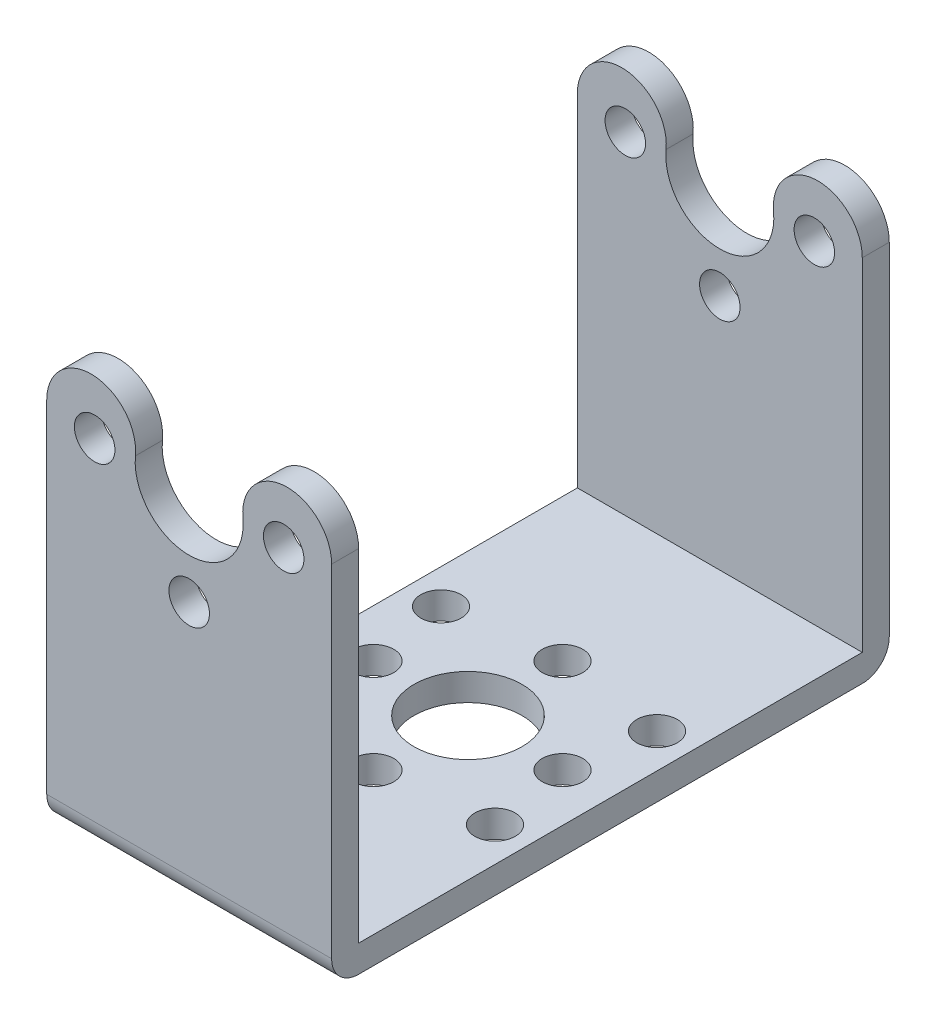
ISO-10303-21;
HEADER;
FILE_DESCRIPTION(('STEP AP214'),'2;1');
FILE_NAME('part.step','',(''),(''),'','','');
FILE_SCHEMA(('AUTOMOTIVE_DESIGN { 1 0 10303 214 1 1 1 1 }'));
ENDSEC;
DATA;
#1=APPLICATION_CONTEXT('core data for automotive mechanical design processes');
#2=APPLICATION_PROTOCOL_DEFINITION('international standard','automotive_design',2000,#1);
#3=PRODUCT_CONTEXT('',#1,'mechanical');
#4=PRODUCT('Part','Part','',(#3));
#5=PRODUCT_RELATED_PRODUCT_CATEGORY('part','',(#4));
#6=PRODUCT_DEFINITION_FORMATION('','',#4);
#7=PRODUCT_DEFINITION_CONTEXT('part definition',#1,'design');
#8=PRODUCT_DEFINITION('design','',#6,#7);
#9=PRODUCT_DEFINITION_SHAPE('','',#8);
#10=(LENGTH_UNIT() NAMED_UNIT(*) SI_UNIT(.MILLI.,.METRE.));
#11=(NAMED_UNIT(*) PLANE_ANGLE_UNIT() SI_UNIT($,.RADIAN.));
#12=(NAMED_UNIT(*) SI_UNIT($,.STERADIAN.) SOLID_ANGLE_UNIT());
#13=UNCERTAINTY_MEASURE_WITH_UNIT(LENGTH_MEASURE(1.E-05),#10,'distance_accuracy_value','');
#14=(GEOMETRIC_REPRESENTATION_CONTEXT(3) GLOBAL_UNCERTAINTY_ASSIGNED_CONTEXT((#13)) GLOBAL_UNIT_ASSIGNED_CONTEXT((#10,
#11,#12)) REPRESENTATION_CONTEXT('',''));
#15=CARTESIAN_POINT('',(0.,0.,0.));
#16=DIRECTION('',(0.,0.,1.));
#17=DIRECTION('',(1.,0.,0.));
#18=AXIS2_PLACEMENT_3D('',#15,#16,#17);
#19=CARTESIAN_POINT('',(-10.55,0.,-20.65));
#20=DIRECTION('',(-1.,0.,0.));
#21=DIRECTION('',(0.,1.,0.));
#22=AXIS2_PLACEMENT_3D('',#19,#20,#21);
#23=PLANE('',#22);
#24=CARTESIAN_POINT('',(-10.55,2.,-18.65));
#25=DIRECTION('',(1.,0.,0.));
#26=DIRECTION('',(0.,-0.707106781186548,-0.707106781186548));
#27=AXIS2_PLACEMENT_3D('',#24,#25,#26);
#28=CIRCLE('',#27,2.);
#29=CARTESIAN_POINT('',(-10.55,0.,-18.65));
#30=VERTEX_POINT('',#29);
#31=CARTESIAN_POINT('',(-10.55,2.,-20.65));
#32=VERTEX_POINT('',#31);
#33=EDGE_CURVE('E36',#30,#32,#28,.T.);
#34=ORIENTED_EDGE('',*,*,#33,.F.);
#35=DIRECTION('',(0.,0.,1.));
#36=VECTOR('',#35,1.);
#37=CARTESIAN_POINT('',(-10.55,0.,-20.65));
#38=LINE('',#37,#36);
#39=CARTESIAN_POINT('',(-10.55,0.,18.65));
#40=VERTEX_POINT('',#39);
#41=EDGE_CURVE('E11',#30,#40,#38,.T.);
#42=ORIENTED_EDGE('',*,*,#41,.T.);
#43=CARTESIAN_POINT('',(-10.55,2.,18.65));
#44=DIRECTION('',(1.,0.,0.));
#45=DIRECTION('',(0.,-0.707106781186548,0.707106781186548));
#46=AXIS2_PLACEMENT_3D('',#43,#44,#45);
#47=CIRCLE('',#46,2.);
#48=CARTESIAN_POINT('',(-10.55,2.,20.65));
#49=VERTEX_POINT('',#48);
#50=EDGE_CURVE('E330',#49,#40,#47,.T.);
#51=ORIENTED_EDGE('',*,*,#50,.F.);
#52=DIRECTION('',(0.,1.,0.));
#53=VECTOR('',#52,1.);
#54=CARTESIAN_POINT('',(-10.55,0.,20.65));
#55=LINE('',#54,#53);
#56=CARTESIAN_POINT('',(-10.55,27.307784898208,20.65));
#57=VERTEX_POINT('',#56);
#58=EDGE_CURVE('E201',#49,#57,#55,.T.);
#59=ORIENTED_EDGE('',*,*,#58,.T.);
#60=DIRECTION('',(0.,0.,1.));
#61=VECTOR('',#60,1.);
#62=CARTESIAN_POINT('',(-10.55,27.307784898208,20.65));
#63=LINE('',#62,#61);
#64=CARTESIAN_POINT('',(-10.55,27.307784898208,18.65));
#65=VERTEX_POINT('',#64);
#66=EDGE_CURVE('E222',#65,#57,#63,.T.);
#67=ORIENTED_EDGE('',*,*,#66,.F.);
#68=DIRECTION('',(0.,1.,0.));
#69=VECTOR('',#68,1.);
#70=CARTESIAN_POINT('',(-10.55,2.,18.65));
#71=LINE('',#70,#69);
#72=CARTESIAN_POINT('',(-10.55,2.,18.65));
#73=VERTEX_POINT('',#72);
#74=EDGE_CURVE('E211',#73,#65,#71,.T.);
#75=ORIENTED_EDGE('',*,*,#74,.F.);
#76=DIRECTION('',(0.,0.,1.));
#77=VECTOR('',#76,1.);
#78=CARTESIAN_POINT('',(-10.55,2.,-20.65));
#79=LINE('',#78,#77);
#80=CARTESIAN_POINT('',(-10.55,2.,-18.65));
#81=VERTEX_POINT('',#80);
#82=EDGE_CURVE('E97',#81,#73,#79,.T.);
#83=ORIENTED_EDGE('',*,*,#82,.F.);
#84=DIRECTION('',(0.,1.,0.));
#85=VECTOR('',#84,1.);
#86=CARTESIAN_POINT('',(-10.55,2.,-18.65));
#87=LINE('',#86,#85);
#88=CARTESIAN_POINT('',(-10.55,27.307784898208,-18.65));
#89=VERTEX_POINT('',#88);
#90=EDGE_CURVE('E289',#81,#89,#87,.T.);
#91=ORIENTED_EDGE('',*,*,#90,.T.);
#92=DIRECTION('',(0.,0.,1.));
#93=VECTOR('',#92,1.);
#94=CARTESIAN_POINT('',(-10.55,27.307784898208,-20.65));
#95=LINE('',#94,#93);
#96=CARTESIAN_POINT('',(-10.55,27.307784898208,-20.65));
#97=VERTEX_POINT('',#96);
#98=EDGE_CURVE('E295',#97,#89,#95,.T.);
#99=ORIENTED_EDGE('',*,*,#98,.F.);
#100=DIRECTION('',(0.,1.,0.));
#101=VECTOR('',#100,1.);
#102=CARTESIAN_POINT('',(-10.55,0.,-20.65));
#103=LINE('',#102,#101);
#104=EDGE_CURVE('E194',#32,#97,#103,.T.);
#105=ORIENTED_EDGE('',*,*,#104,.F.);
#106=EDGE_LOOP('',(#34,#42,#51,#59,#67,#75,#83,#91,#99,#105));
#107=FACE_BOUND('',#106,.T.);
#108=ADVANCED_FACE('F17',(#107),#23,.T.);
#109=CARTESIAN_POINT('',(0.,0.,0.));
#110=DIRECTION('',(0.,1.,0.));
#111=DIRECTION('',(1.,0.,0.));
#112=AXIS2_PLACEMENT_3D('',#109,#110,#111);
#113=PLANE('',#112);
#114=DIRECTION('',(-1.,0.,0.));
#115=VECTOR('',#114,1.);
#116=CARTESIAN_POINT('',(5.275,0.,-18.65));
#117=LINE('',#116,#115);
#118=CARTESIAN_POINT('',(10.55,0.,-18.65));
#119=VERTEX_POINT('',#118);
#120=EDGE_CURVE('E27',#119,#30,#117,.T.);
#121=ORIENTED_EDGE('',*,*,#120,.F.);
#122=DIRECTION('',(0.,0.,-1.));
#123=VECTOR('',#122,1.);
#124=CARTESIAN_POINT('',(10.55,0.,20.65));
#125=LINE('',#124,#123);
#126=CARTESIAN_POINT('',(10.55,0.,18.65));
#127=VERTEX_POINT('',#126);
#128=EDGE_CURVE('E175',#127,#119,#125,.T.);
#129=ORIENTED_EDGE('',*,*,#128,.F.);
#130=DIRECTION('',(1.,0.,0.));
#131=VECTOR('',#130,1.);
#132=CARTESIAN_POINT('',(-5.275,0.,18.65));
#133=LINE('',#132,#131);
#134=EDGE_CURVE('E180',#40,#127,#133,.T.);
#135=ORIENTED_EDGE('',*,*,#134,.F.);
#136=ORIENTED_EDGE('',*,*,#41,.F.);
#137=EDGE_LOOP('',(#121,#129,#135,#136));
#138=FACE_BOUND('',#137,.T.);
#139=CARTESIAN_POINT('',(-8.,0.,-6.));
#140=DIRECTION('',(0.,1.,0.));
#141=DIRECTION('',(1.,0.,0.));
#142=AXIS2_PLACEMENT_3D('',#139,#140,#141);
#143=CIRCLE('',#142,1.5);
#144=CARTESIAN_POINT('',(-6.5,0.,-6.));
#145=VERTEX_POINT('',#144);
#146=EDGE_CURVE('E412',#145,#145,#143,.T.);
#147=ORIENTED_EDGE('',*,*,#146,.T.);
#148=EDGE_LOOP('',(#147));
#149=FACE_BOUND('',#148,.T.);
#150=CARTESIAN_POINT('',(8.,0.,6.));
#151=DIRECTION('',(0.,1.,0.));
#152=DIRECTION('',(1.,0.,0.));
#153=AXIS2_PLACEMENT_3D('',#150,#151,#152);
#154=CIRCLE('',#153,1.5);
#155=CARTESIAN_POINT('',(9.5,0.,6.));
#156=VERTEX_POINT('',#155);
#157=EDGE_CURVE('E399',#156,#156,#154,.T.);
#158=ORIENTED_EDGE('',*,*,#157,.T.);
#159=EDGE_LOOP('',(#158));
#160=FACE_BOUND('',#159,.T.);
#161=CARTESIAN_POINT('',(7.,0.,0.));
#162=DIRECTION('',(0.,1.,0.));
#163=DIRECTION('',(1.,0.,0.));
#164=AXIS2_PLACEMENT_3D('',#161,#162,#163);
#165=CIRCLE('',#164,1.5);
#166=CARTESIAN_POINT('',(8.5,0.,0.));
#167=VERTEX_POINT('',#166);
#168=EDGE_CURVE('E392',#167,#167,#165,.T.);
#169=ORIENTED_EDGE('',*,*,#168,.T.);
#170=EDGE_LOOP('',(#169));
#171=FACE_BOUND('',#170,.T.);
#172=CARTESIAN_POINT('',(-7.,0.,0.));
#173=DIRECTION('',(0.,1.,0.));
#174=DIRECTION('',(1.,0.,0.));
#175=AXIS2_PLACEMENT_3D('',#172,#173,#174);
#176=CIRCLE('',#175,1.5);
#177=CARTESIAN_POINT('',(-5.5,0.,0.));
#178=VERTEX_POINT('',#177);
#179=EDGE_CURVE('E381',#178,#178,#176,.T.);
#180=ORIENTED_EDGE('',*,*,#179,.T.);
#181=EDGE_LOOP('',(#180));
#182=FACE_BOUND('',#181,.T.);
#183=CARTESIAN_POINT('',(0.,0.,-7.));
#184=DIRECTION('',(0.,1.,0.));
#185=DIRECTION('',(1.,0.,0.));
#186=AXIS2_PLACEMENT_3D('',#183,#184,#185);
#187=CIRCLE('',#186,1.5);
#188=CARTESIAN_POINT('',(1.5,0.,-7.));
#189=VERTEX_POINT('',#188);
#190=EDGE_CURVE('E366',#189,#189,#187,.T.);
#191=ORIENTED_EDGE('',*,*,#190,.T.);
#192=EDGE_LOOP('',(#191));
#193=FACE_BOUND('',#192,.T.);
#194=CARTESIAN_POINT('',(0.,0.,7.));
#195=DIRECTION('',(0.,1.,0.));
#196=DIRECTION('',(1.,0.,0.));
#197=AXIS2_PLACEMENT_3D('',#194,#195,#196);
#198=CIRCLE('',#197,1.5);
#199=CARTESIAN_POINT('',(1.5,0.,7.));
#200=VERTEX_POINT('',#199);
#201=EDGE_CURVE('E359',#200,#200,#198,.T.);
#202=ORIENTED_EDGE('',*,*,#201,.T.);
#203=EDGE_LOOP('',(#202));
#204=FACE_BOUND('',#203,.T.);
#205=CARTESIAN_POINT('',(8.,0.,-6.));
#206=DIRECTION('',(0.,1.,0.));
#207=DIRECTION('',(1.,0.,0.));
#208=AXIS2_PLACEMENT_3D('',#205,#206,#207);
#209=CIRCLE('',#208,1.5);
#210=CARTESIAN_POINT('',(9.5,0.,-6.));
#211=VERTEX_POINT('',#210);
#212=EDGE_CURVE('E355',#211,#211,#209,.T.);
#213=ORIENTED_EDGE('',*,*,#212,.T.);
#214=EDGE_LOOP('',(#213));
#215=FACE_BOUND('',#214,.T.);
#216=CARTESIAN_POINT('',(-8.,0.,6.));
#217=DIRECTION('',(0.,1.,0.));
#218=DIRECTION('',(1.,0.,0.));
#219=AXIS2_PLACEMENT_3D('',#216,#217,#218);
#220=CIRCLE('',#219,1.5);
#221=CARTESIAN_POINT('',(-6.5,0.,6.));
#222=VERTEX_POINT('',#221);
#223=EDGE_CURVE('E342',#222,#222,#220,.T.);
#224=ORIENTED_EDGE('',*,*,#223,.T.);
#225=EDGE_LOOP('',(#224));
#226=FACE_BOUND('',#225,.T.);
#227=CARTESIAN_POINT('',(0.,0.,0.));
#228=DIRECTION('',(0.,1.,0.));
#229=DIRECTION('',(1.,0.,0.));
#230=AXIS2_PLACEMENT_3D('',#227,#228,#229);
#231=CIRCLE('',#230,4.);
#232=CARTESIAN_POINT('',(4.,0.,0.));
#233=VERTEX_POINT('',#232);
#234=EDGE_CURVE('E169',#233,#233,#231,.T.);
#235=ORIENTED_EDGE('',*,*,#234,.T.);
#236=EDGE_LOOP('',(#235));
#237=FACE_BOUND('',#236,.T.);
#238=ADVANCED_FACE('F172',(#138,#149,#160,#171,#182,#193,#204,#215,#226,#237),#113,.F.);
#239=CARTESIAN_POINT('',(10.55,0.,20.65));
#240=DIRECTION('',(1.,0.,0.));
#241=DIRECTION('',(0.,0.,1.));
#242=AXIS2_PLACEMENT_3D('',#239,#240,#241);
#243=PLANE('',#242);
#244=CARTESIAN_POINT('',(10.55,2.,-18.65));
#245=DIRECTION('',(-1.,0.,0.));
#246=DIRECTION('',(0.,-0.707106781186548,-0.707106781186548));
#247=AXIS2_PLACEMENT_3D('',#244,#245,#246);
#248=CIRCLE('',#247,2.);
#249=CARTESIAN_POINT('',(10.55,2.,-20.65));
#250=VERTEX_POINT('',#249);
#251=EDGE_CURVE('E157',#250,#119,#248,.T.);
#252=ORIENTED_EDGE('',*,*,#251,.F.);
#253=DIRECTION('',(0.,1.,0.));
#254=VECTOR('',#253,1.);
#255=CARTESIAN_POINT('',(10.55,0.,-20.65));
#256=LINE('',#255,#254);
#257=CARTESIAN_POINT('',(10.55,27.307784898208,-20.65));
#258=VERTEX_POINT('',#257);
#259=EDGE_CURVE('E189',#250,#258,#256,.T.);
#260=ORIENTED_EDGE('',*,*,#259,.T.);
#261=DIRECTION('',(0.,0.,1.));
#262=VECTOR('',#261,1.);
#263=CARTESIAN_POINT('',(10.55,27.307784898208,-20.65));
#264=LINE('',#263,#262);
#265=CARTESIAN_POINT('',(10.55,27.307784898208,-18.65));
#266=VERTEX_POINT('',#265);
#267=EDGE_CURVE('E183',#258,#266,#264,.T.);
#268=ORIENTED_EDGE('',*,*,#267,.T.);
#269=DIRECTION('',(0.,1.,0.));
#270=VECTOR('',#269,1.);
#271=CARTESIAN_POINT('',(10.55,2.,-18.65));
#272=LINE('',#271,#270);
#273=CARTESIAN_POINT('',(10.55,2.,-18.65));
#274=VERTEX_POINT('',#273);
#275=EDGE_CURVE('E196',#274,#266,#272,.T.);
#276=ORIENTED_EDGE('',*,*,#275,.F.);
#277=DIRECTION('',(0.,0.,-1.));
#278=VECTOR('',#277,1.);
#279=CARTESIAN_POINT('',(10.55,2.,20.65));
#280=LINE('',#279,#278);
#281=CARTESIAN_POINT('',(10.55,2.,18.65));
#282=VERTEX_POINT('',#281);
#283=EDGE_CURVE('E203',#282,#274,#280,.T.);
#284=ORIENTED_EDGE('',*,*,#283,.F.);
#285=DIRECTION('',(0.,1.,0.));
#286=VECTOR('',#285,1.);
#287=CARTESIAN_POINT('',(10.55,2.,18.65));
#288=LINE('',#287,#286);
#289=CARTESIAN_POINT('',(10.55,27.307784898208,18.65));
#290=VERTEX_POINT('',#289);
#291=EDGE_CURVE('E215',#282,#290,#288,.T.);
#292=ORIENTED_EDGE('',*,*,#291,.T.);
#293=DIRECTION('',(0.,0.,1.));
#294=VECTOR('',#293,1.);
#295=CARTESIAN_POINT('',(10.55,27.307784898208,20.65));
#296=LINE('',#295,#294);
#297=CARTESIAN_POINT('',(10.55,27.307784898208,20.65));
#298=VERTEX_POINT('',#297);
#299=EDGE_CURVE('E206',#290,#298,#296,.T.);
#300=ORIENTED_EDGE('',*,*,#299,.T.);
#301=DIRECTION('',(0.,1.,0.));
#302=VECTOR('',#301,1.);
#303=CARTESIAN_POINT('',(10.55,0.,20.65));
#304=LINE('',#303,#302);
#305=CARTESIAN_POINT('',(10.55,2.,20.65));
#306=VERTEX_POINT('',#305);
#307=EDGE_CURVE('E210',#306,#298,#304,.T.);
#308=ORIENTED_EDGE('',*,*,#307,.F.);
#309=CARTESIAN_POINT('',(10.55,2.,18.65));
#310=DIRECTION('',(-1.,0.,0.));
#311=DIRECTION('',(0.,-0.707106781186548,0.707106781186548));
#312=AXIS2_PLACEMENT_3D('',#309,#310,#311);
#313=CIRCLE('',#312,2.);
#314=EDGE_CURVE('E179',#127,#306,#313,.T.);
#315=ORIENTED_EDGE('',*,*,#314,.F.);
#316=ORIENTED_EDGE('',*,*,#128,.T.);
#317=EDGE_LOOP('',(#252,#260,#268,#276,#284,#292,#300,#308,#315,#316));
#318=FACE_BOUND('',#317,.T.);
#319=ADVANCED_FACE('F178',(#318),#243,.T.);
#320=CARTESIAN_POINT('',(10.55,0.,-20.65));
#321=DIRECTION('',(0.,0.,-1.));
#322=DIRECTION('',(0.,-1.,0.));
#323=AXIS2_PLACEMENT_3D('',#320,#321,#322);
#324=PLANE('',#323);
#325=DIRECTION('',(1.,0.,0.));
#326=VECTOR('',#325,1.);
#327=CARTESIAN_POINT('',(5.275,2.,-20.65));
#328=LINE('',#327,#326);
#329=EDGE_CURVE('E162',#32,#250,#328,.T.);
#330=ORIENTED_EDGE('',*,*,#329,.F.);
#331=ORIENTED_EDGE('',*,*,#104,.T.);
#332=CARTESIAN_POINT('',(-7.257784898209,27.307784898208,-20.65));
#333=DIRECTION('',(0.,0.,-1.));
#334=DIRECTION('',(-1.,0.,0.));
#335=AXIS2_PLACEMENT_3D('',#332,#333,#334);
#336=CIRCLE('',#335,3.292215101791);
#337=CARTESIAN_POINT('',(-3.981113994526,26.988241371561,-20.65));
#338=VERTEX_POINT('',#337);
#339=EDGE_CURVE('E294',#97,#338,#336,.T.);
#340=ORIENTED_EDGE('',*,*,#339,.T.);
#341=CARTESIAN_POINT('',(0.,26.6,-20.65));
#342=DIRECTION('',(0.,0.,1.));
#343=DIRECTION('',(1.,0.,0.));
#344=AXIS2_PLACEMENT_3D('',#341,#342,#343);
#345=CIRCLE('',#344,4.);
#346=CARTESIAN_POINT('',(3.981113994526,26.988241371561,-20.65));
#347=VERTEX_POINT('',#346);
#348=EDGE_CURVE('E284',#338,#347,#345,.T.);
#349=ORIENTED_EDGE('',*,*,#348,.T.);
#350=CARTESIAN_POINT('',(7.257784898209,27.307784898208,-20.65));
#351=DIRECTION('',(0.,0.,-1.));
#352=DIRECTION('',(-1.,0.,0.));
#353=AXIS2_PLACEMENT_3D('',#350,#351,#352);
#354=CIRCLE('',#353,3.292215101791);
#355=EDGE_CURVE('E301',#347,#258,#354,.T.);
#356=ORIENTED_EDGE('',*,*,#355,.T.);
#357=ORIENTED_EDGE('',*,*,#259,.F.);
#358=EDGE_LOOP('',(#330,#331,#340,#349,#356,#357));
#359=FACE_BOUND('',#358,.T.);
#360=CARTESIAN_POINT('',(7.,26.6,-20.65));
#361=DIRECTION('',(0.,0.,1.));
#362=DIRECTION('',(1.,0.,0.));
#363=AXIS2_PLACEMENT_3D('',#360,#361,#362);
#364=CIRCLE('',#363,1.5);
#365=CARTESIAN_POINT('',(8.5,26.6,-20.65));
#366=VERTEX_POINT('',#365);
#367=EDGE_CURVE('E259',#366,#366,#364,.T.);
#368=ORIENTED_EDGE('',*,*,#367,.T.);
#369=EDGE_LOOP('',(#368));
#370=FACE_BOUND('',#369,.T.);
#371=CARTESIAN_POINT('',(-7.,26.6,-20.65));
#372=DIRECTION('',(0.,0.,1.));
#373=DIRECTION('',(1.,0.,0.));
#374=AXIS2_PLACEMENT_3D('',#371,#372,#373);
#375=CIRCLE('',#374,1.5);
#376=CARTESIAN_POINT('',(-5.5,26.6,-20.65));
#377=VERTEX_POINT('',#376);
#378=EDGE_CURVE('E270',#377,#377,#375,.T.);
#379=ORIENTED_EDGE('',*,*,#378,.T.);
#380=EDGE_LOOP('',(#379));
#381=FACE_BOUND('',#380,.T.);
#382=CARTESIAN_POINT('',(0.,19.6,-20.65));
#383=DIRECTION('',(0.,0.,1.));
#384=DIRECTION('',(1.,0.,0.));
#385=AXIS2_PLACEMENT_3D('',#382,#383,#384);
#386=CIRCLE('',#385,1.5);
#387=CARTESIAN_POINT('',(1.5,19.6,-20.65));
#388=VERTEX_POINT('',#387);
#389=EDGE_CURVE('E273',#388,#388,#386,.T.);
#390=ORIENTED_EDGE('',*,*,#389,.T.);
#391=EDGE_LOOP('',(#390));
#392=FACE_BOUND('',#391,.T.);
#393=ADVANCED_FACE('F472',(#359,#370,#381,#392),#324,.T.);
#394=CARTESIAN_POINT('',(10.55,2.,-18.65));
#395=DIRECTION('',(0.,0.,-1.));
#396=DIRECTION('',(0.,-1.,0.));
#397=AXIS2_PLACEMENT_3D('',#394,#395,#396);
#398=PLANE('',#397);
#399=CARTESIAN_POINT('',(0.,26.6,-18.65));
#400=DIRECTION('',(0.,0.,-1.));
#401=DIRECTION('',(1.,0.,0.));
#402=AXIS2_PLACEMENT_3D('',#399,#400,#401);
#403=CIRCLE('',#402,4.);
#404=CARTESIAN_POINT('',(3.981113994526,26.988241371561,-18.65));
#405=VERTEX_POINT('',#404);
#406=CARTESIAN_POINT('',(-3.981113994526,26.988241371561,-18.65));
#407=VERTEX_POINT('',#406);
#408=EDGE_CURVE('E286',#405,#407,#403,.T.);
#409=ORIENTED_EDGE('',*,*,#408,.T.);
#410=CARTESIAN_POINT('',(-7.257784898209,27.307784898208,-18.65));
#411=DIRECTION('',(0.,0.,1.));
#412=DIRECTION('',(-1.,0.,0.));
#413=AXIS2_PLACEMENT_3D('',#410,#411,#412);
#414=CIRCLE('',#413,3.292215101791);
#415=EDGE_CURVE('E299',#407,#89,#414,.T.);
#416=ORIENTED_EDGE('',*,*,#415,.T.);
#417=ORIENTED_EDGE('',*,*,#90,.F.);
#418=DIRECTION('',(-1.,0.,0.));
#419=VECTOR('',#418,1.);
#420=CARTESIAN_POINT('',(5.275,2.,-18.65));
#421=LINE('',#420,#419);
#422=EDGE_CURVE('E205',#274,#81,#421,.T.);
#423=ORIENTED_EDGE('',*,*,#422,.F.);
#424=ORIENTED_EDGE('',*,*,#275,.T.);
#425=CARTESIAN_POINT('',(7.257784898209,27.307784898208,-18.65));
#426=DIRECTION('',(0.,0.,1.));
#427=DIRECTION('',(-1.,0.,0.));
#428=AXIS2_PLACEMENT_3D('',#425,#426,#427);
#429=CIRCLE('',#428,3.292215101791);
#430=EDGE_CURVE('E306',#266,#405,#429,.T.);
#431=ORIENTED_EDGE('',*,*,#430,.T.);
#432=EDGE_LOOP('',(#409,#416,#417,#423,#424,#431));
#433=FACE_BOUND('',#432,.T.);
#434=CARTESIAN_POINT('',(0.,19.6,-18.65));
#435=DIRECTION('',(0.,0.,-1.));
#436=DIRECTION('',(1.,0.,0.));
#437=AXIS2_PLACEMENT_3D('',#434,#435,#436);
#438=CIRCLE('',#437,1.5);
#439=CARTESIAN_POINT('',(1.5,19.6,-18.65));
#440=VERTEX_POINT('',#439);
#441=EDGE_CURVE('E279',#440,#440,#438,.T.);
#442=ORIENTED_EDGE('',*,*,#441,.T.);
#443=EDGE_LOOP('',(#442));
#444=FACE_BOUND('',#443,.T.);
#445=CARTESIAN_POINT('',(-7.,26.6,-18.65));
#446=DIRECTION('',(0.,0.,-1.));
#447=DIRECTION('',(1.,0.,0.));
#448=AXIS2_PLACEMENT_3D('',#445,#446,#447);
#449=CIRCLE('',#448,1.5);
#450=CARTESIAN_POINT('',(-5.5,26.6,-18.65));
#451=VERTEX_POINT('',#450);
#452=EDGE_CURVE('E271',#451,#451,#449,.T.);
#453=ORIENTED_EDGE('',*,*,#452,.T.);
#454=EDGE_LOOP('',(#453));
#455=FACE_BOUND('',#454,.T.);
#456=CARTESIAN_POINT('',(7.,26.6,-18.65));
#457=DIRECTION('',(0.,0.,-1.));
#458=DIRECTION('',(1.,0.,0.));
#459=AXIS2_PLACEMENT_3D('',#456,#457,#458);
#460=CIRCLE('',#459,1.5);
#461=CARTESIAN_POINT('',(8.5,26.6,-18.65));
#462=VERTEX_POINT('',#461);
#463=EDGE_CURVE('E263',#462,#462,#460,.T.);
#464=ORIENTED_EDGE('',*,*,#463,.T.);
#465=EDGE_LOOP('',(#464));
#466=FACE_BOUND('',#465,.T.);
#467=ADVANCED_FACE('F480',(#433,#444,#455,#466),#398,.F.);
#468=CARTESIAN_POINT('',(0.,2.,0.));
#469=DIRECTION('',(0.,1.,0.));
#470=DIRECTION('',(1.,0.,0.));
#471=AXIS2_PLACEMENT_3D('',#468,#469,#470);
#472=PLANE('',#471);
#473=ORIENTED_EDGE('',*,*,#422,.T.);
#474=ORIENTED_EDGE('',*,*,#82,.T.);
#475=DIRECTION('',(1.,0.,0.));
#476=VECTOR('',#475,1.);
#477=CARTESIAN_POINT('',(5.275,2.,18.65));
#478=LINE('',#477,#476);
#479=EDGE_CURVE('E208',#73,#282,#478,.T.);
#480=ORIENTED_EDGE('',*,*,#479,.T.);
#481=ORIENTED_EDGE('',*,*,#283,.T.);
#482=EDGE_LOOP('',(#473,#474,#480,#481));
#483=FACE_BOUND('',#482,.T.);
#484=CARTESIAN_POINT('',(-8.,2.,-6.));
#485=DIRECTION('',(0.,-1.,0.));
#486=DIRECTION('',(1.,0.,0.));
#487=AXIS2_PLACEMENT_3D('',#484,#485,#486);
#488=CIRCLE('',#487,1.5);
#489=CARTESIAN_POINT('',(-6.5,2.,-6.));
#490=VERTEX_POINT('',#489);
#491=EDGE_CURVE('E416',#490,#490,#488,.T.);
#492=ORIENTED_EDGE('',*,*,#491,.T.);
#493=EDGE_LOOP('',(#492));
#494=FACE_BOUND('',#493,.T.);
#495=CARTESIAN_POINT('',(8.,2.,6.));
#496=DIRECTION('',(0.,-1.,0.));
#497=DIRECTION('',(1.,0.,0.));
#498=AXIS2_PLACEMENT_3D('',#495,#496,#497);
#499=CIRCLE('',#498,1.5);
#500=CARTESIAN_POINT('',(9.5,2.,6.));
#501=VERTEX_POINT('',#500);
#502=EDGE_CURVE('E410',#501,#501,#499,.T.);
#503=ORIENTED_EDGE('',*,*,#502,.T.);
#504=EDGE_LOOP('',(#503));
#505=FACE_BOUND('',#504,.T.);
#506=CARTESIAN_POINT('',(7.,2.,0.));
#507=DIRECTION('',(0.,-1.,0.));
#508=DIRECTION('',(1.,0.,0.));
#509=AXIS2_PLACEMENT_3D('',#506,#507,#508);
#510=CIRCLE('',#509,1.5);
#511=CARTESIAN_POINT('',(8.5,2.,0.));
#512=VERTEX_POINT('',#511);
#513=EDGE_CURVE('E396',#512,#512,#510,.T.);
#514=ORIENTED_EDGE('',*,*,#513,.T.);
#515=EDGE_LOOP('',(#514));
#516=FACE_BOUND('',#515,.T.);
#517=CARTESIAN_POINT('',(-7.,2.,0.));
#518=DIRECTION('',(0.,-1.,0.));
#519=DIRECTION('',(1.,0.,0.));
#520=AXIS2_PLACEMENT_3D('',#517,#518,#519);
#521=CIRCLE('',#520,1.5);
#522=CARTESIAN_POINT('',(-5.5,2.,0.));
#523=VERTEX_POINT('',#522);
#524=EDGE_CURVE('E384',#523,#523,#521,.T.);
#525=ORIENTED_EDGE('',*,*,#524,.T.);
#526=EDGE_LOOP('',(#525));
#527=FACE_BOUND('',#526,.T.);
#528=CARTESIAN_POINT('',(0.,2.,-7.));
#529=DIRECTION('',(0.,-1.,0.));
#530=DIRECTION('',(1.,0.,0.));
#531=AXIS2_PLACEMENT_3D('',#528,#529,#530);
#532=CIRCLE('',#531,1.5);
#533=CARTESIAN_POINT('',(1.5,2.,-7.));
#534=VERTEX_POINT('',#533);
#535=EDGE_CURVE('E380',#534,#534,#532,.T.);
#536=ORIENTED_EDGE('',*,*,#535,.T.);
#537=EDGE_LOOP('',(#536));
#538=FACE_BOUND('',#537,.T.);
#539=CARTESIAN_POINT('',(0.,2.,7.));
#540=DIRECTION('',(0.,-1.,0.));
#541=DIRECTION('',(1.,0.,0.));
#542=AXIS2_PLACEMENT_3D('',#539,#540,#541);
#543=CIRCLE('',#542,1.5);
#544=CARTESIAN_POINT('',(1.5,2.,7.));
#545=VERTEX_POINT('',#544);
#546=EDGE_CURVE('E365',#545,#545,#543,.T.);
#547=ORIENTED_EDGE('',*,*,#546,.T.);
#548=EDGE_LOOP('',(#547));
#549=FACE_BOUND('',#548,.T.);
#550=CARTESIAN_POINT('',(8.,2.,-6.));
#551=DIRECTION('',(0.,-1.,0.));
#552=DIRECTION('',(1.,0.,0.));
#553=AXIS2_PLACEMENT_3D('',#550,#551,#552);
#554=CIRCLE('',#553,1.5);
#555=CARTESIAN_POINT('',(9.5,2.,-6.));
#556=VERTEX_POINT('',#555);
#557=EDGE_CURVE('E356',#556,#556,#554,.T.);
#558=ORIENTED_EDGE('',*,*,#557,.T.);
#559=EDGE_LOOP('',(#558));
#560=FACE_BOUND('',#559,.T.);
#561=CARTESIAN_POINT('',(-8.,2.,6.));
#562=DIRECTION('',(0.,-1.,0.));
#563=DIRECTION('',(1.,0.,0.));
#564=AXIS2_PLACEMENT_3D('',#561,#562,#563);
#565=CIRCLE('',#564,1.5);
#566=CARTESIAN_POINT('',(-6.5,2.,6.));
#567=VERTEX_POINT('',#566);
#568=EDGE_CURVE('E351',#567,#567,#565,.T.);
#569=ORIENTED_EDGE('',*,*,#568,.T.);
#570=EDGE_LOOP('',(#569));
#571=FACE_BOUND('',#570,.T.);
#572=CARTESIAN_POINT('',(0.,2.,0.));
#573=DIRECTION('',(0.,-1.,0.));
#574=DIRECTION('',(1.,0.,0.));
#575=AXIS2_PLACEMENT_3D('',#572,#573,#574);
#576=CIRCLE('',#575,4.);
#577=CARTESIAN_POINT('',(4.,2.,0.));
#578=VERTEX_POINT('',#577);
#579=EDGE_CURVE('E340',#578,#578,#576,.T.);
#580=ORIENTED_EDGE('',*,*,#579,.T.);
#581=EDGE_LOOP('',(#580));
#582=FACE_BOUND('',#581,.T.);
#583=ADVANCED_FACE('F449',(#483,#494,#505,#516,#527,#538,#549,#560,#571,#582),#472,.T.);
#584=CARTESIAN_POINT('',(-10.55,0.,20.65));
#585=DIRECTION('',(0.,0.,1.));
#586=DIRECTION('',(1.,0.,0.));
#587=AXIS2_PLACEMENT_3D('',#584,#585,#586);
#588=PLANE('',#587);
#589=DIRECTION('',(-1.,0.,0.));
#590=VECTOR('',#589,1.);
#591=CARTESIAN_POINT('',(-5.275,2.,20.65));
#592=LINE('',#591,#590);
#593=EDGE_CURVE('E312',#306,#49,#592,.T.);
#594=ORIENTED_EDGE('',*,*,#593,.F.);
#595=ORIENTED_EDGE('',*,*,#307,.T.);
#596=CARTESIAN_POINT('',(7.257784898209,27.307784898208,20.65));
#597=DIRECTION('',(0.,0.,1.));
#598=DIRECTION('',(-1.,0.,0.));
#599=AXIS2_PLACEMENT_3D('',#596,#597,#598);
#600=CIRCLE('',#599,3.292215101791);
#601=CARTESIAN_POINT('',(3.981113994526,26.988241371561,20.65));
#602=VERTEX_POINT('',#601);
#603=EDGE_CURVE('E82',#298,#602,#600,.T.);
#604=ORIENTED_EDGE('',*,*,#603,.T.);
#605=CARTESIAN_POINT('',(0.,26.6,20.65));
#606=DIRECTION('',(0.,0.,-1.));
#607=DIRECTION('',(1.,0.,0.));
#608=AXIS2_PLACEMENT_3D('',#605,#606,#607);
#609=CIRCLE('',#608,4.);
#610=CARTESIAN_POINT('',(-3.981113994526,26.988241371561,20.65));
#611=VERTEX_POINT('',#610);
#612=EDGE_CURVE('E220',#602,#611,#609,.T.);
#613=ORIENTED_EDGE('',*,*,#612,.T.);
#614=CARTESIAN_POINT('',(-7.257784898209,27.307784898208,20.65));
#615=DIRECTION('',(0.,0.,1.));
#616=DIRECTION('',(-1.,0.,0.));
#617=AXIS2_PLACEMENT_3D('',#614,#615,#616);
#618=CIRCLE('',#617,3.292215101791);
#619=EDGE_CURVE('E223',#611,#57,#618,.T.);
#620=ORIENTED_EDGE('',*,*,#619,.T.);
#621=ORIENTED_EDGE('',*,*,#58,.F.);
#622=EDGE_LOOP('',(#594,#595,#604,#613,#620,#621));
#623=FACE_BOUND('',#622,.T.);
#624=CARTESIAN_POINT('',(7.,26.6,20.65));
#625=DIRECTION('',(0.,0.,-1.));
#626=DIRECTION('',(1.,0.,0.));
#627=AXIS2_PLACEMENT_3D('',#624,#625,#626);
#628=CIRCLE('',#627,1.5);
#629=CARTESIAN_POINT('',(8.5,26.6,20.65));
#630=VERTEX_POINT('',#629);
#631=EDGE_CURVE('E252',#630,#630,#628,.T.);
#632=ORIENTED_EDGE('',*,*,#631,.T.);
#633=EDGE_LOOP('',(#632));
#634=FACE_BOUND('',#633,.T.);
#635=CARTESIAN_POINT('',(0.,19.6,20.65));
#636=DIRECTION('',(0.,0.,-1.));
#637=DIRECTION('',(1.,0.,0.));
#638=AXIS2_PLACEMENT_3D('',#635,#636,#637);
#639=CIRCLE('',#638,1.5);
#640=CARTESIAN_POINT('',(1.5,19.6,20.65));
#641=VERTEX_POINT('',#640);
#642=EDGE_CURVE('E253',#641,#641,#639,.T.);
#643=ORIENTED_EDGE('',*,*,#642,.T.);
#644=EDGE_LOOP('',(#643));
#645=FACE_BOUND('',#644,.T.);
#646=CARTESIAN_POINT('',(-7.,26.6,20.65));
#647=DIRECTION('',(0.,0.,-1.));
#648=DIRECTION('',(1.,0.,0.));
#649=AXIS2_PLACEMENT_3D('',#646,#647,#648);
#650=CIRCLE('',#649,1.5);
#651=CARTESIAN_POINT('',(-5.5,26.6,20.65));
#652=VERTEX_POINT('',#651);
#653=EDGE_CURVE('E245',#652,#652,#650,.T.);
#654=ORIENTED_EDGE('',*,*,#653,.T.);
#655=EDGE_LOOP('',(#654));
#656=FACE_BOUND('',#655,.T.);
#657=ADVANCED_FACE('F443',(#623,#634,#645,#656),#588,.T.);
#658=CARTESIAN_POINT('',(10.55,2.,18.65));
#659=DIRECTION('',(0.,0.,-1.));
#660=DIRECTION('',(-1.,0.,0.));
#661=AXIS2_PLACEMENT_3D('',#658,#659,#660);
#662=PLANE('',#661);
#663=CARTESIAN_POINT('',(7.257784898209,27.307784898208,18.65));
#664=DIRECTION('',(0.,0.,-1.));
#665=DIRECTION('',(-1.,0.,0.));
#666=AXIS2_PLACEMENT_3D('',#663,#664,#665);
#667=CIRCLE('',#666,3.292215101791);
#668=CARTESIAN_POINT('',(3.981113994526,26.988241371561,18.65));
#669=VERTEX_POINT('',#668);
#670=EDGE_CURVE('E233',#669,#290,#667,.T.);
#671=ORIENTED_EDGE('',*,*,#670,.T.);
#672=ORIENTED_EDGE('',*,*,#291,.F.);
#673=ORIENTED_EDGE('',*,*,#479,.F.);
#674=ORIENTED_EDGE('',*,*,#74,.T.);
#675=CARTESIAN_POINT('',(-7.257784898209,27.307784898208,18.65));
#676=DIRECTION('',(0.,0.,-1.));
#677=DIRECTION('',(-1.,0.,0.));
#678=AXIS2_PLACEMENT_3D('',#675,#676,#677);
#679=CIRCLE('',#678,3.292215101791);
#680=CARTESIAN_POINT('',(-3.981113994526,26.988241371561,18.65));
#681=VERTEX_POINT('',#680);
#682=EDGE_CURVE('E225',#65,#681,#679,.T.);
#683=ORIENTED_EDGE('',*,*,#682,.T.);
#684=CARTESIAN_POINT('',(0.,26.6,18.65));
#685=DIRECTION('',(0.,0.,1.));
#686=DIRECTION('',(1.,0.,0.));
#687=AXIS2_PLACEMENT_3D('',#684,#685,#686);
#688=CIRCLE('',#687,4.);
#689=EDGE_CURVE('E213',#681,#669,#688,.T.);
#690=ORIENTED_EDGE('',*,*,#689,.T.);
#691=EDGE_LOOP('',(#671,#672,#673,#674,#683,#690));
#692=FACE_BOUND('',#691,.T.);
#693=CARTESIAN_POINT('',(7.,26.6,18.65));
#694=DIRECTION('',(0.,0.,1.));
#695=DIRECTION('',(1.,0.,0.));
#696=AXIS2_PLACEMENT_3D('',#693,#694,#695);
#697=CIRCLE('',#696,1.5);
#698=CARTESIAN_POINT('',(8.5,26.6,18.65));
#699=VERTEX_POINT('',#698);
#700=EDGE_CURVE('E250',#699,#699,#697,.T.);
#701=ORIENTED_EDGE('',*,*,#700,.T.);
#702=EDGE_LOOP('',(#701));
#703=FACE_BOUND('',#702,.T.);
#704=CARTESIAN_POINT('',(0.,19.6,18.65));
#705=DIRECTION('',(0.,0.,1.));
#706=DIRECTION('',(1.,0.,0.));
#707=AXIS2_PLACEMENT_3D('',#704,#705,#706);
#708=CIRCLE('',#707,1.5);
#709=CARTESIAN_POINT('',(1.5,19.6,18.65));
#710=VERTEX_POINT('',#709);
#711=EDGE_CURVE('E246',#710,#710,#708,.T.);
#712=ORIENTED_EDGE('',*,*,#711,.T.);
#713=EDGE_LOOP('',(#712));
#714=FACE_BOUND('',#713,.T.);
#715=CARTESIAN_POINT('',(-7.,26.6,18.65));
#716=DIRECTION('',(0.,0.,1.));
#717=DIRECTION('',(1.,0.,0.));
#718=AXIS2_PLACEMENT_3D('',#715,#716,#717);
#719=CIRCLE('',#718,1.5);
#720=CARTESIAN_POINT('',(-5.5,26.6,18.65));
#721=VERTEX_POINT('',#720);
#722=EDGE_CURVE('E238',#721,#721,#719,.T.);
#723=ORIENTED_EDGE('',*,*,#722,.T.);
#724=EDGE_LOOP('',(#723));
#725=FACE_BOUND('',#724,.T.);
#726=ADVANCED_FACE('F432',(#692,#703,#714,#725),#662,.T.);
#727=CARTESIAN_POINT('',(0.,26.6,20.65));
#728=DIRECTION('',(0.,0.,-1.));
#729=DIRECTION('',(0.,-1.,0.));
#730=AXIS2_PLACEMENT_3D('',#727,#728,#729);
#731=CYLINDRICAL_SURFACE('',#730,4.);
#732=ORIENTED_EDGE('',*,*,#612,.F.);
#733=DIRECTION('',(0.,0.,-1.));
#734=VECTOR('',#733,1.);
#735=CARTESIAN_POINT('',(3.981113994526,26.988241371561,20.65));
#736=LINE('',#735,#734);
#737=EDGE_CURVE('E228',#602,#669,#736,.T.);
#738=ORIENTED_EDGE('',*,*,#737,.T.);
#739=ORIENTED_EDGE('',*,*,#689,.F.);
#740=DIRECTION('',(0.,0.,-1.));
#741=VECTOR('',#740,1.);
#742=CARTESIAN_POINT('',(-3.981113994526,26.988241371561,20.65));
#743=LINE('',#742,#741);
#744=EDGE_CURVE('E216',#611,#681,#743,.T.);
#745=ORIENTED_EDGE('',*,*,#744,.F.);
#746=EDGE_LOOP('',(#732,#738,#739,#745));
#747=FACE_BOUND('',#746,.T.);
#748=ADVANCED_FACE('F486',(#747),#731,.F.);
#749=CARTESIAN_POINT('',(-7.257784898209,27.307784898208,20.65));
#750=DIRECTION('',(0.,0.,-1.));
#751=DIRECTION('',(0.0485875568873679,0.998818927191369,0.));
#752=AXIS2_PLACEMENT_3D('',#749,#750,#751);
#753=CYLINDRICAL_SURFACE('',#752,3.292215101791);
#754=ORIENTED_EDGE('',*,*,#619,.F.);
#755=ORIENTED_EDGE('',*,*,#744,.T.);
#756=ORIENTED_EDGE('',*,*,#682,.F.);
#757=ORIENTED_EDGE('',*,*,#66,.T.);
#758=EDGE_LOOP('',(#754,#755,#756,#757));
#759=FACE_BOUND('',#758,.T.);
#760=ADVANCED_FACE('F461',(#759),#753,.T.);
#761=CARTESIAN_POINT('',(7.257784898209,27.307784898208,20.65));
#762=DIRECTION('',(0.,0.,-1.));
#763=DIRECTION('',(-1.,0.,0.));
#764=AXIS2_PLACEMENT_3D('',#761,#762,#763);
#765=CYLINDRICAL_SURFACE('',#764,3.292215101791);
#766=ORIENTED_EDGE('',*,*,#603,.F.);
#767=ORIENTED_EDGE('',*,*,#299,.F.);
#768=ORIENTED_EDGE('',*,*,#670,.F.);
#769=ORIENTED_EDGE('',*,*,#737,.F.);
#770=EDGE_LOOP('',(#766,#767,#768,#769));
#771=FACE_BOUND('',#770,.T.);
#772=ADVANCED_FACE('F452',(#771),#765,.T.);
#773=CARTESIAN_POINT('',(-7.,26.6,20.65));
#774=DIRECTION('',(0.,0.,-1.));
#775=DIRECTION('',(1.,0.,0.));
#776=AXIS2_PLACEMENT_3D('',#773,#774,#775);
#777=CYLINDRICAL_SURFACE('',#776,1.5);
#778=ORIENTED_EDGE('',*,*,#722,.F.);
#779=EDGE_LOOP('',(#778));
#780=FACE_BOUND('',#779,.T.);
#781=ORIENTED_EDGE('',*,*,#653,.F.);
#782=EDGE_LOOP('',(#781));
#783=FACE_BOUND('',#782,.T.);
#784=ADVANCED_FACE('F442',(#780,#783),#777,.F.);
#785=CARTESIAN_POINT('',(0.,19.6,20.65));
#786=DIRECTION('',(0.,0.,-1.));
#787=DIRECTION('',(1.,0.,0.));
#788=AXIS2_PLACEMENT_3D('',#785,#786,#787);
#789=CYLINDRICAL_SURFACE('',#788,1.5);
#790=ORIENTED_EDGE('',*,*,#711,.F.);
#791=EDGE_LOOP('',(#790));
#792=FACE_BOUND('',#791,.T.);
#793=ORIENTED_EDGE('',*,*,#642,.F.);
#794=EDGE_LOOP('',(#793));
#795=FACE_BOUND('',#794,.T.);
#796=ADVANCED_FACE('F440',(#792,#795),#789,.F.);
#797=CARTESIAN_POINT('',(7.,26.6,20.65));
#798=DIRECTION('',(0.,0.,-1.));
#799=DIRECTION('',(1.,0.,0.));
#800=AXIS2_PLACEMENT_3D('',#797,#798,#799);
#801=CYLINDRICAL_SURFACE('',#800,1.5);
#802=ORIENTED_EDGE('',*,*,#700,.F.);
#803=EDGE_LOOP('',(#802));
#804=FACE_BOUND('',#803,.T.);
#805=ORIENTED_EDGE('',*,*,#631,.F.);
#806=EDGE_LOOP('',(#805));
#807=FACE_BOUND('',#806,.T.);
#808=ADVANCED_FACE('F439',(#804,#807),#801,.F.);
#809=CARTESIAN_POINT('',(7.,26.6,-20.65));
#810=DIRECTION('',(0.,0.,-1.));
#811=DIRECTION('',(1.,0.,0.));
#812=AXIS2_PLACEMENT_3D('',#809,#810,#811);
#813=CYLINDRICAL_SURFACE('',#812,1.5);
#814=ORIENTED_EDGE('',*,*,#367,.F.);
#815=EDGE_LOOP('',(#814));
#816=FACE_BOUND('',#815,.T.);
#817=ORIENTED_EDGE('',*,*,#463,.F.);
#818=EDGE_LOOP('',(#817));
#819=FACE_BOUND('',#818,.T.);
#820=ADVANCED_FACE('F492',(#816,#819),#813,.F.);
#821=CARTESIAN_POINT('',(-7.,26.6,-20.65));
#822=DIRECTION('',(0.,0.,-1.));
#823=DIRECTION('',(1.,0.,0.));
#824=AXIS2_PLACEMENT_3D('',#821,#822,#823);
#825=CYLINDRICAL_SURFACE('',#824,1.5);
#826=ORIENTED_EDGE('',*,*,#378,.F.);
#827=EDGE_LOOP('',(#826));
#828=FACE_BOUND('',#827,.T.);
#829=ORIENTED_EDGE('',*,*,#452,.F.);
#830=EDGE_LOOP('',(#829));
#831=FACE_BOUND('',#830,.T.);
#832=ADVANCED_FACE('F500',(#828,#831),#825,.F.);
#833=CARTESIAN_POINT('',(0.,19.6,-20.65));
#834=DIRECTION('',(0.,0.,-1.));
#835=DIRECTION('',(1.,0.,0.));
#836=AXIS2_PLACEMENT_3D('',#833,#834,#835);
#837=CYLINDRICAL_SURFACE('',#836,1.5);
#838=ORIENTED_EDGE('',*,*,#389,.F.);
#839=EDGE_LOOP('',(#838));
#840=FACE_BOUND('',#839,.T.);
#841=ORIENTED_EDGE('',*,*,#441,.F.);
#842=EDGE_LOOP('',(#841));
#843=FACE_BOUND('',#842,.T.);
#844=ADVANCED_FACE('F501',(#840,#843),#837,.F.);
#845=CARTESIAN_POINT('',(0.,26.6,-20.65));
#846=DIRECTION('',(0.,0.,-1.));
#847=DIRECTION('',(0.,-1.,0.));
#848=AXIS2_PLACEMENT_3D('',#845,#846,#847);
#849=CYLINDRICAL_SURFACE('',#848,4.);
#850=ORIENTED_EDGE('',*,*,#408,.F.);
#851=DIRECTION('',(0.,0.,1.));
#852=VECTOR('',#851,1.);
#853=CARTESIAN_POINT('',(3.981113994526,26.988241371561,-20.65));
#854=LINE('',#853,#852);
#855=EDGE_CURVE('E296',#347,#405,#854,.T.);
#856=ORIENTED_EDGE('',*,*,#855,.F.);
#857=ORIENTED_EDGE('',*,*,#348,.F.);
#858=DIRECTION('',(0.,0.,1.));
#859=VECTOR('',#858,1.);
#860=CARTESIAN_POINT('',(-3.981113994526,26.988241371561,-20.65));
#861=LINE('',#860,#859);
#862=EDGE_CURVE('E282',#338,#407,#861,.T.);
#863=ORIENTED_EDGE('',*,*,#862,.T.);
#864=EDGE_LOOP('',(#850,#856,#857,#863));
#865=FACE_BOUND('',#864,.T.);
#866=ADVANCED_FACE('F509',(#865),#849,.F.);
#867=CARTESIAN_POINT('',(-7.257784898209,27.307784898208,-20.65));
#868=DIRECTION('',(0.,0.,-1.));
#869=DIRECTION('',(0.0485875568873679,0.998818927191369,0.));
#870=AXIS2_PLACEMENT_3D('',#867,#868,#869);
#871=CYLINDRICAL_SURFACE('',#870,3.292215101791);
#872=ORIENTED_EDGE('',*,*,#415,.F.);
#873=ORIENTED_EDGE('',*,*,#862,.F.);
#874=ORIENTED_EDGE('',*,*,#339,.F.);
#875=ORIENTED_EDGE('',*,*,#98,.T.);
#876=EDGE_LOOP('',(#872,#873,#874,#875));
#877=FACE_BOUND('',#876,.T.);
#878=ADVANCED_FACE('F506',(#877),#871,.T.);
#879=CARTESIAN_POINT('',(7.257784898209,27.307784898208,-20.65));
#880=DIRECTION('',(0.,0.,-1.));
#881=DIRECTION('',(-1.,0.,0.));
#882=AXIS2_PLACEMENT_3D('',#879,#880,#881);
#883=CYLINDRICAL_SURFACE('',#882,3.292215101791);
#884=ORIENTED_EDGE('',*,*,#430,.F.);
#885=ORIENTED_EDGE('',*,*,#267,.F.);
#886=ORIENTED_EDGE('',*,*,#355,.F.);
#887=ORIENTED_EDGE('',*,*,#855,.T.);
#888=EDGE_LOOP('',(#884,#885,#886,#887));
#889=FACE_BOUND('',#888,.T.);
#890=ADVANCED_FACE('F507',(#889),#883,.T.);
#891=CARTESIAN_POINT('',(-5.275,2.,18.65));
#892=DIRECTION('',(1.,0.,0.));
#893=DIRECTION('',(0.,-0.707106781186548,0.707106781186548));
#894=AXIS2_PLACEMENT_3D('',#891,#892,#893);
#895=CYLINDRICAL_SURFACE('',#894,2.);
#896=ORIENTED_EDGE('',*,*,#50,.T.);
#897=ORIENTED_EDGE('',*,*,#134,.T.);
#898=ORIENTED_EDGE('',*,*,#314,.T.);
#899=ORIENTED_EDGE('',*,*,#593,.T.);
#900=EDGE_LOOP('',(#896,#897,#898,#899));
#901=FACE_BOUND('',#900,.T.);
#902=ADVANCED_FACE('F520',(#901),#895,.T.);
#903=CARTESIAN_POINT('',(5.275,2.,-18.65));
#904=DIRECTION('',(-1.,0.,0.));
#905=DIRECTION('',(0.,-0.707106781186548,-0.707106781186548));
#906=AXIS2_PLACEMENT_3D('',#903,#904,#905);
#907=CYLINDRICAL_SURFACE('',#906,2.);
#908=ORIENTED_EDGE('',*,*,#251,.T.);
#909=ORIENTED_EDGE('',*,*,#120,.T.);
#910=ORIENTED_EDGE('',*,*,#33,.T.);
#911=ORIENTED_EDGE('',*,*,#329,.T.);
#912=EDGE_LOOP('',(#908,#909,#910,#911));
#913=FACE_BOUND('',#912,.T.);
#914=ADVANCED_FACE('F161',(#913),#907,.T.);
#915=CARTESIAN_POINT('',(0.,2.,0.));
#916=DIRECTION('',(0.,-1.,0.));
#917=DIRECTION('',(1.,0.,0.));
#918=AXIS2_PLACEMENT_3D('',#915,#916,#917);
#919=CYLINDRICAL_SURFACE('',#918,4.);
#920=ORIENTED_EDGE('',*,*,#234,.F.);
#921=EDGE_LOOP('',(#920));
#922=FACE_BOUND('',#921,.T.);
#923=ORIENTED_EDGE('',*,*,#579,.F.);
#924=EDGE_LOOP('',(#923));
#925=FACE_BOUND('',#924,.T.);
#926=ADVANCED_FACE('F522',(#922,#925),#919,.F.);
#927=CARTESIAN_POINT('',(-8.,2.,6.));
#928=DIRECTION('',(0.,-1.,0.));
#929=DIRECTION('',(1.,0.,0.));
#930=AXIS2_PLACEMENT_3D('',#927,#928,#929);
#931=CYLINDRICAL_SURFACE('',#930,1.5);
#932=ORIENTED_EDGE('',*,*,#223,.F.);
#933=EDGE_LOOP('',(#932));
#934=FACE_BOUND('',#933,.T.);
#935=ORIENTED_EDGE('',*,*,#568,.F.);
#936=EDGE_LOOP('',(#935));
#937=FACE_BOUND('',#936,.T.);
#938=ADVANCED_FACE('F527',(#934,#937),#931,.F.);
#939=CARTESIAN_POINT('',(8.,2.,-6.));
#940=DIRECTION('',(0.,-1.,0.));
#941=DIRECTION('',(1.,0.,0.));
#942=AXIS2_PLACEMENT_3D('',#939,#940,#941);
#943=CYLINDRICAL_SURFACE('',#942,1.5);
#944=ORIENTED_EDGE('',*,*,#212,.F.);
#945=EDGE_LOOP('',(#944));
#946=FACE_BOUND('',#945,.T.);
#947=ORIENTED_EDGE('',*,*,#557,.F.);
#948=EDGE_LOOP('',(#947));
#949=FACE_BOUND('',#948,.T.);
#950=ADVANCED_FACE('F533',(#946,#949),#943,.F.);
#951=CARTESIAN_POINT('',(0.,2.,7.));
#952=DIRECTION('',(0.,-1.,0.));
#953=DIRECTION('',(1.,0.,0.));
#954=AXIS2_PLACEMENT_3D('',#951,#952,#953);
#955=CYLINDRICAL_SURFACE('',#954,1.5);
#956=ORIENTED_EDGE('',*,*,#201,.F.);
#957=EDGE_LOOP('',(#956));
#958=FACE_BOUND('',#957,.T.);
#959=ORIENTED_EDGE('',*,*,#546,.F.);
#960=EDGE_LOOP('',(#959));
#961=FACE_BOUND('',#960,.T.);
#962=ADVANCED_FACE('F538',(#958,#961),#955,.F.);
#963=CARTESIAN_POINT('',(0.,2.,-7.));
#964=DIRECTION('',(0.,-1.,0.));
#965=DIRECTION('',(1.,0.,0.));
#966=AXIS2_PLACEMENT_3D('',#963,#964,#965);
#967=CYLINDRICAL_SURFACE('',#966,1.5);
#968=ORIENTED_EDGE('',*,*,#190,.F.);
#969=EDGE_LOOP('',(#968));
#970=FACE_BOUND('',#969,.T.);
#971=ORIENTED_EDGE('',*,*,#535,.F.);
#972=EDGE_LOOP('',(#971));
#973=FACE_BOUND('',#972,.T.);
#974=ADVANCED_FACE('F539',(#970,#973),#967,.F.);
#975=CARTESIAN_POINT('',(-7.,2.,0.));
#976=DIRECTION('',(0.,-1.,0.));
#977=DIRECTION('',(1.,0.,0.));
#978=AXIS2_PLACEMENT_3D('',#975,#976,#977);
#979=CYLINDRICAL_SURFACE('',#978,1.5);
#980=ORIENTED_EDGE('',*,*,#179,.F.);
#981=EDGE_LOOP('',(#980));
#982=FACE_BOUND('',#981,.T.);
#983=ORIENTED_EDGE('',*,*,#524,.F.);
#984=EDGE_LOOP('',(#983));
#985=FACE_BOUND('',#984,.T.);
#986=ADVANCED_FACE('F543',(#982,#985),#979,.F.);
#987=CARTESIAN_POINT('',(7.,2.,0.));
#988=DIRECTION('',(0.,-1.,0.));
#989=DIRECTION('',(1.,0.,0.));
#990=AXIS2_PLACEMENT_3D('',#987,#988,#989);
#991=CYLINDRICAL_SURFACE('',#990,1.5);
#992=ORIENTED_EDGE('',*,*,#168,.F.);
#993=EDGE_LOOP('',(#992));
#994=FACE_BOUND('',#993,.T.);
#995=ORIENTED_EDGE('',*,*,#513,.F.);
#996=EDGE_LOOP('',(#995));
#997=FACE_BOUND('',#996,.T.);
#998=ADVANCED_FACE('F549',(#994,#997),#991,.F.);
#999=CARTESIAN_POINT('',(8.,2.,6.));
#1000=DIRECTION('',(0.,-1.,0.));
#1001=DIRECTION('',(1.,0.,0.));
#1002=AXIS2_PLACEMENT_3D('',#999,#1000,#1001);
#1003=CYLINDRICAL_SURFACE('',#1002,1.5);
#1004=ORIENTED_EDGE('',*,*,#157,.F.);
#1005=EDGE_LOOP('',(#1004));
#1006=FACE_BOUND('',#1005,.T.);
#1007=ORIENTED_EDGE('',*,*,#502,.F.);
#1008=EDGE_LOOP('',(#1007));
#1009=FACE_BOUND('',#1008,.T.);
#1010=ADVANCED_FACE('F551',(#1006,#1009),#1003,.F.);
#1011=CARTESIAN_POINT('',(-8.,2.,-6.));
#1012=DIRECTION('',(0.,-1.,0.));
#1013=DIRECTION('',(1.,0.,0.));
#1014=AXIS2_PLACEMENT_3D('',#1011,#1012,#1013);
#1015=CYLINDRICAL_SURFACE('',#1014,1.5);
#1016=ORIENTED_EDGE('',*,*,#146,.F.);
#1017=EDGE_LOOP('',(#1016));
#1018=FACE_BOUND('',#1017,.T.);
#1019=ORIENTED_EDGE('',*,*,#491,.F.);
#1020=EDGE_LOOP('',(#1019));
#1021=FACE_BOUND('',#1020,.T.);
#1022=ADVANCED_FACE('F556',(#1018,#1021),#1015,.F.);
#1023=CLOSED_SHELL('',(#108,#238,#319,#393,#467,#583,#657,#726,#748,#760,#772,#784,#796,#808,
#820,#832,#844,#866,#878,#890,#902,#914,#926,#938,#950,#962,#974,#986,#998,#1010,#1022));
#1024=MANIFOLD_SOLID_BREP('B1',#1023);
#1025=ADVANCED_BREP_SHAPE_REPRESENTATION('',(#18,#1024),#14);
#1026=SHAPE_DEFINITION_REPRESENTATION(#9,#1025);
ENDSEC;
END-ISO-10303-21;
